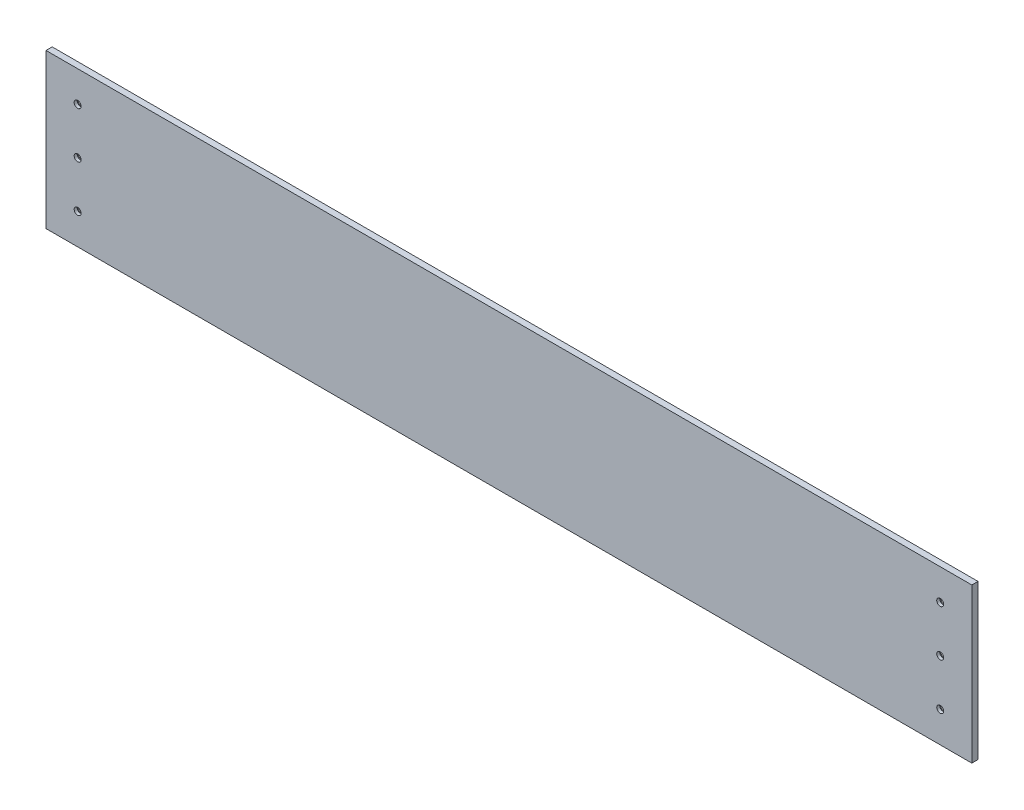
ISO-10303-21;
HEADER;
FILE_DESCRIPTION(('STEP AP214'),'2;1');
FILE_NAME('part.step','',(''),(''),'','','');
FILE_SCHEMA(('AUTOMOTIVE_DESIGN { 1 0 10303 214 1 1 1 1 }'));
ENDSEC;
DATA;
#1=APPLICATION_CONTEXT('core data for automotive mechanical design processes');
#2=APPLICATION_PROTOCOL_DEFINITION('international standard','automotive_design',2000,#1);
#3=PRODUCT_CONTEXT('',#1,'mechanical');
#4=PRODUCT('Part','Part','',(#3));
#5=PRODUCT_RELATED_PRODUCT_CATEGORY('part','',(#4));
#6=PRODUCT_DEFINITION_FORMATION('','',#4);
#7=PRODUCT_DEFINITION_CONTEXT('part definition',#1,'design');
#8=PRODUCT_DEFINITION('design','',#6,#7);
#9=PRODUCT_DEFINITION_SHAPE('','',#8);
#10=(LENGTH_UNIT() NAMED_UNIT(*) SI_UNIT(.MILLI.,.METRE.));
#11=(NAMED_UNIT(*) PLANE_ANGLE_UNIT() SI_UNIT($,.RADIAN.));
#12=(NAMED_UNIT(*) SI_UNIT($,.STERADIAN.) SOLID_ANGLE_UNIT());
#13=UNCERTAINTY_MEASURE_WITH_UNIT(LENGTH_MEASURE(1.E-05),#10,'distance_accuracy_value','');
#14=(GEOMETRIC_REPRESENTATION_CONTEXT(3) GLOBAL_UNCERTAINTY_ASSIGNED_CONTEXT((#13)) GLOBAL_UNIT_ASSIGNED_CONTEXT((#10,
#11,#12)) REPRESENTATION_CONTEXT('',''));
#15=CARTESIAN_POINT('',(0.,0.,0.));
#16=DIRECTION('',(0.,0.,1.));
#17=DIRECTION('',(1.,0.,0.));
#18=AXIS2_PLACEMENT_3D('',#15,#16,#17);
#19=CARTESIAN_POINT('',(579.5,80.,5.6843418860808E-11));
#20=DIRECTION('',(0.,0.,-1.));
#21=DIRECTION('',(-1.,0.,0.));
#22=AXIS2_PLACEMENT_3D('',#19,#20,#21);
#23=CONICAL_SURFACE('',#22,4.29999999994779,0.785398163411313);
#24=CARTESIAN_POINT('',(579.5,80.,2.05));
#25=DIRECTION('',(0.,0.,-1.));
#26=DIRECTION('',(-1.,0.,0.));
#27=AXIS2_PLACEMENT_3D('',#24,#25,#26);
#28=CIRCLE('',#27,2.24999999999997);
#29=CARTESIAN_POINT('',(577.25,80.,2.05));
#30=VERTEX_POINT('',#29);
#31=EDGE_CURVE('E96',#30,#30,#28,.F.);
#32=ORIENTED_EDGE('',*,*,#31,.T.);
#33=EDGE_LOOP('',(#32));
#34=FACE_BOUND('',#33,.T.);
#35=CARTESIAN_POINT('',(579.5,80.,6.08402217493478E-11));
#36=DIRECTION('',(0.,0.,-1.));
#37=DIRECTION('',(-1.,0.,0.));
#38=AXIS2_PLACEMENT_3D('',#35,#36,#37);
#39=CIRCLE('',#38,4.29999999994379);
#40=CARTESIAN_POINT('',(575.200000000056,80.,6.08402217493478E-11));
#41=VERTEX_POINT('',#40);
#42=EDGE_CURVE('E20',#41,#41,#39,.F.);
#43=ORIENTED_EDGE('',*,*,#42,.F.);
#44=EDGE_LOOP('',(#43));
#45=FACE_BOUND('',#44,.T.);
#46=ADVANCED_FACE('F17',(#34,#45),#23,.F.);
#47=CARTESIAN_POINT('',(579.5,50.,5.6843418860808E-11));
#48=DIRECTION('',(0.,0.,-1.));
#49=DIRECTION('',(-1.,0.,0.));
#50=AXIS2_PLACEMENT_3D('',#47,#48,#49);
#51=CONICAL_SURFACE('',#50,4.2999999999479,0.785398163411313);
#52=CARTESIAN_POINT('',(579.5,50.,2.05));
#53=DIRECTION('',(0.,0.,-1.));
#54=DIRECTION('',(-1.,0.,0.));
#55=AXIS2_PLACEMENT_3D('',#52,#53,#54);
#56=CIRCLE('',#55,2.24999999999997);
#57=CARTESIAN_POINT('',(577.25,50.,2.05));
#58=VERTEX_POINT('',#57);
#59=EDGE_CURVE('E93',#58,#58,#56,.F.);
#60=ORIENTED_EDGE('',*,*,#59,.T.);
#61=EDGE_LOOP('',(#60));
#62=FACE_BOUND('',#61,.T.);
#63=CARTESIAN_POINT('',(579.5,50.,6.09512440518072E-11));
#64=DIRECTION('',(0.,0.,-1.));
#65=DIRECTION('',(-1.,0.,0.));
#66=AXIS2_PLACEMENT_3D('',#63,#64,#65);
#67=CIRCLE('',#66,4.29999999994379);
#68=CARTESIAN_POINT('',(575.200000000056,50.,6.09512440518072E-11));
#69=VERTEX_POINT('',#68);
#70=EDGE_CURVE('E128',#69,#69,#67,.F.);
#71=ORIENTED_EDGE('',*,*,#70,.F.);
#72=EDGE_LOOP('',(#71));
#73=FACE_BOUND('',#72,.T.);
#74=ADVANCED_FACE('F137',(#62,#73),#51,.F.);
#75=CARTESIAN_POINT('',(579.5,20.,5.6843418860808E-11));
#76=DIRECTION('',(0.,0.,-1.));
#77=DIRECTION('',(-1.,0.,0.));
#78=AXIS2_PLACEMENT_3D('',#75,#76,#77);
#79=CONICAL_SURFACE('',#78,4.29999999994779,0.785398163411313);
#80=CARTESIAN_POINT('',(579.5,20.,2.05));
#81=DIRECTION('',(0.,0.,-1.));
#82=DIRECTION('',(-1.,0.,0.));
#83=AXIS2_PLACEMENT_3D('',#80,#81,#82);
#84=CIRCLE('',#83,2.24999999999997);
#85=CARTESIAN_POINT('',(577.25,20.,2.05));
#86=VERTEX_POINT('',#85);
#87=EDGE_CURVE('E90',#86,#86,#84,.F.);
#88=ORIENTED_EDGE('',*,*,#87,.T.);
#89=EDGE_LOOP('',(#88));
#90=FACE_BOUND('',#89,.T.);
#91=CARTESIAN_POINT('',(579.5,20.,6.08402217493478E-11));
#92=DIRECTION('',(0.,0.,-1.));
#93=DIRECTION('',(-1.,0.,0.));
#94=AXIS2_PLACEMENT_3D('',#91,#92,#93);
#95=CIRCLE('',#94,4.29999999994379);
#96=CARTESIAN_POINT('',(575.200000000056,20.,6.08402217493478E-11));
#97=VERTEX_POINT('',#96);
#98=EDGE_CURVE('E126',#97,#97,#95,.F.);
#99=ORIENTED_EDGE('',*,*,#98,.F.);
#100=EDGE_LOOP('',(#99));
#101=FACE_BOUND('',#100,.T.);
#102=ADVANCED_FACE('F143',(#90,#101),#79,.F.);
#103=CARTESIAN_POINT('',(20.5,20.,5.6843418860808E-11));
#104=DIRECTION('',(0.,0.,-1.));
#105=DIRECTION('',(-1.,0.,0.));
#106=AXIS2_PLACEMENT_3D('',#103,#104,#105);
#107=CONICAL_SURFACE('',#106,4.29999999991701,0.785398163397448);
#108=CARTESIAN_POINT('',(20.5,20.,2.05));
#109=DIRECTION('',(0.,0.,-1.));
#110=DIRECTION('',(-1.,0.,0.));
#111=AXIS2_PLACEMENT_3D('',#108,#109,#110);
#112=CIRCLE('',#111,2.25);
#113=CARTESIAN_POINT('',(18.25,20.,2.05));
#114=VERTEX_POINT('',#113);
#115=EDGE_CURVE('E87',#114,#114,#112,.F.);
#116=ORIENTED_EDGE('',*,*,#115,.T.);
#117=EDGE_LOOP('',(#116));
#118=FACE_BOUND('',#117,.T.);
#119=CARTESIAN_POINT('',(20.5,20.,0.));
#120=DIRECTION('',(0.,0.,-1.));
#121=DIRECTION('',(-1.,0.,0.));
#122=AXIS2_PLACEMENT_3D('',#119,#120,#121);
#123=CIRCLE('',#122,4.29999999997385);
#124=CARTESIAN_POINT('',(16.2000000000262,20.,0.));
#125=VERTEX_POINT('',#124);
#126=EDGE_CURVE('E123',#125,#125,#123,.F.);
#127=ORIENTED_EDGE('',*,*,#126,.F.);
#128=EDGE_LOOP('',(#127));
#129=FACE_BOUND('',#128,.T.);
#130=ADVANCED_FACE('F198',(#118,#129),#107,.F.);
#131=CARTESIAN_POINT('',(20.5,50.,5.6843418860808E-11));
#132=DIRECTION('',(0.,0.,-1.));
#133=DIRECTION('',(-1.,0.,0.));
#134=AXIS2_PLACEMENT_3D('',#131,#132,#133);
#135=CONICAL_SURFACE('',#134,4.29999999991698,0.785398163397448);
#136=CARTESIAN_POINT('',(20.5,50.,2.05));
#137=DIRECTION('',(0.,0.,-1.));
#138=DIRECTION('',(-1.,0.,0.));
#139=AXIS2_PLACEMENT_3D('',#136,#137,#138);
#140=CIRCLE('',#139,2.25);
#141=CARTESIAN_POINT('',(18.25,50.,2.05));
#142=VERTEX_POINT('',#141);
#143=EDGE_CURVE('E84',#142,#142,#140,.F.);
#144=ORIENTED_EDGE('',*,*,#143,.T.);
#145=EDGE_LOOP('',(#144));
#146=FACE_BOUND('',#145,.T.);
#147=CARTESIAN_POINT('',(20.5,50.,0.));
#148=DIRECTION('',(0.,0.,-1.));
#149=DIRECTION('',(-1.,0.,0.));
#150=AXIS2_PLACEMENT_3D('',#147,#148,#149);
#151=CIRCLE('',#150,4.29999999997382);
#152=CARTESIAN_POINT('',(16.2000000000262,50.,0.));
#153=VERTEX_POINT('',#152);
#154=EDGE_CURVE('E120',#153,#153,#151,.F.);
#155=ORIENTED_EDGE('',*,*,#154,.F.);
#156=EDGE_LOOP('',(#155));
#157=FACE_BOUND('',#156,.T.);
#158=ADVANCED_FACE('F194',(#146,#157),#135,.F.);
#159=CARTESIAN_POINT('',(20.5,80.,5.6843418860808E-11));
#160=DIRECTION('',(0.,0.,-1.));
#161=DIRECTION('',(-1.,0.,0.));
#162=AXIS2_PLACEMENT_3D('',#159,#160,#161);
#163=CONICAL_SURFACE('',#162,4.29999999991701,0.785398163397448);
#164=CARTESIAN_POINT('',(20.5,80.,2.05));
#165=DIRECTION('',(0.,0.,-1.));
#166=DIRECTION('',(-1.,0.,0.));
#167=AXIS2_PLACEMENT_3D('',#164,#165,#166);
#168=CIRCLE('',#167,2.25);
#169=CARTESIAN_POINT('',(18.25,80.,2.05));
#170=VERTEX_POINT('',#169);
#171=EDGE_CURVE('E67',#170,#170,#168,.F.);
#172=ORIENTED_EDGE('',*,*,#171,.T.);
#173=EDGE_LOOP('',(#172));
#174=FACE_BOUND('',#173,.T.);
#175=CARTESIAN_POINT('',(20.5,80.,0.));
#176=DIRECTION('',(0.,0.,-1.));
#177=DIRECTION('',(-1.,0.,0.));
#178=AXIS2_PLACEMENT_3D('',#175,#176,#177);
#179=CIRCLE('',#178,4.29999999997385);
#180=CARTESIAN_POINT('',(16.2000000000262,80.,0.));
#181=VERTEX_POINT('',#180);
#182=EDGE_CURVE('E99',#181,#181,#179,.F.);
#183=ORIENTED_EDGE('',*,*,#182,.F.);
#184=EDGE_LOOP('',(#183));
#185=FACE_BOUND('',#184,.T.);
#186=ADVANCED_FACE('F191',(#174,#185),#163,.F.);
#187=CARTESIAN_POINT('',(0.,0.,0.));
#188=DIRECTION('',(0.,0.,-1.));
#189=DIRECTION('',(-1.,0.,0.));
#190=AXIS2_PLACEMENT_3D('',#187,#188,#189);
#191=PLANE('',#190);
#192=DIRECTION('',(0.,1.,0.));
#193=VECTOR('',#192,1.);
#194=CARTESIAN_POINT('',(600.,0.,0.));
#195=LINE('',#194,#193);
#196=CARTESIAN_POINT('',(600.,100.,0.));
#197=VERTEX_POINT('',#196);
#198=CARTESIAN_POINT('',(600.,0.,0.));
#199=VERTEX_POINT('',#198);
#200=EDGE_CURVE('E55',#197,#199,#195,.F.);
#201=ORIENTED_EDGE('',*,*,#200,.T.);
#202=DIRECTION('',(1.,0.,0.));
#203=VECTOR('',#202,1.);
#204=CARTESIAN_POINT('',(0.,0.,0.));
#205=LINE('',#204,#203);
#206=CARTESIAN_POINT('',(0.,0.,0.));
#207=VERTEX_POINT('',#206);
#208=EDGE_CURVE('E352',#199,#207,#205,.F.);
#209=ORIENTED_EDGE('',*,*,#208,.T.);
#210=DIRECTION('',(0.,1.,0.));
#211=VECTOR('',#210,1.);
#212=CARTESIAN_POINT('',(0.,0.,0.));
#213=LINE('',#212,#211);
#214=CARTESIAN_POINT('',(0.,100.,0.));
#215=VERTEX_POINT('',#214);
#216=EDGE_CURVE('E61',#207,#215,#213,.T.);
#217=ORIENTED_EDGE('',*,*,#216,.T.);
#218=DIRECTION('',(1.,0.,0.));
#219=VECTOR('',#218,1.);
#220=CARTESIAN_POINT('',(0.,100.,0.));
#221=LINE('',#220,#219);
#222=EDGE_CURVE('E58',#215,#197,#221,.T.);
#223=ORIENTED_EDGE('',*,*,#222,.T.);
#224=EDGE_LOOP('',(#201,#209,#217,#223));
#225=FACE_BOUND('',#224,.T.);
#226=ORIENTED_EDGE('',*,*,#182,.T.);
#227=EDGE_LOOP('',(#226));
#228=FACE_BOUND('',#227,.T.);
#229=ORIENTED_EDGE('',*,*,#154,.T.);
#230=EDGE_LOOP('',(#229));
#231=FACE_BOUND('',#230,.T.);
#232=ORIENTED_EDGE('',*,*,#126,.T.);
#233=EDGE_LOOP('',(#232));
#234=FACE_BOUND('',#233,.T.);
#235=ORIENTED_EDGE('',*,*,#98,.T.);
#236=EDGE_LOOP('',(#235));
#237=FACE_BOUND('',#236,.T.);
#238=ORIENTED_EDGE('',*,*,#70,.T.);
#239=EDGE_LOOP('',(#238));
#240=FACE_BOUND('',#239,.T.);
#241=ORIENTED_EDGE('',*,*,#42,.T.);
#242=EDGE_LOOP('',(#241));
#243=FACE_BOUND('',#242,.T.);
#244=ADVANCED_FACE('F59',(#225,#228,#231,#234,#237,#240,#243),#191,.T.);
#245=CARTESIAN_POINT('',(579.5,80.,0.));
#246=DIRECTION('',(0.,0.,-1.));
#247=DIRECTION('',(-1.,0.,0.));
#248=AXIS2_PLACEMENT_3D('',#245,#246,#247);
#249=CYLINDRICAL_SURFACE('',#248,2.24999999999997);
#250=CARTESIAN_POINT('',(579.5,80.,4.));
#251=DIRECTION('',(0.,0.,-1.));
#252=DIRECTION('',(-1.,0.,0.));
#253=AXIS2_PLACEMENT_3D('',#250,#251,#252);
#254=CIRCLE('',#253,2.24999999999997);
#255=CARTESIAN_POINT('',(577.25,80.,4.));
#256=VERTEX_POINT('',#255);
#257=EDGE_CURVE('E115',#256,#256,#254,.F.);
#258=ORIENTED_EDGE('',*,*,#257,.T.);
#259=EDGE_LOOP('',(#258));
#260=FACE_BOUND('',#259,.T.);
#261=ORIENTED_EDGE('',*,*,#31,.F.);
#262=EDGE_LOOP('',(#261));
#263=FACE_BOUND('',#262,.T.);
#264=ADVANCED_FACE('F184',(#260,#263),#249,.F.);
#265=CARTESIAN_POINT('',(579.5,50.,0.));
#266=DIRECTION('',(0.,0.,-1.));
#267=DIRECTION('',(-1.,0.,0.));
#268=AXIS2_PLACEMENT_3D('',#265,#266,#267);
#269=CYLINDRICAL_SURFACE('',#268,2.24999999999997);
#270=CARTESIAN_POINT('',(579.5,50.,4.));
#271=DIRECTION('',(0.,0.,-1.));
#272=DIRECTION('',(-1.,0.,0.));
#273=AXIS2_PLACEMENT_3D('',#270,#271,#272);
#274=CIRCLE('',#273,2.24999999999997);
#275=CARTESIAN_POINT('',(577.25,50.,4.));
#276=VERTEX_POINT('',#275);
#277=EDGE_CURVE('E112',#276,#276,#274,.F.);
#278=ORIENTED_EDGE('',*,*,#277,.T.);
#279=EDGE_LOOP('',(#278));
#280=FACE_BOUND('',#279,.T.);
#281=ORIENTED_EDGE('',*,*,#59,.F.);
#282=EDGE_LOOP('',(#281));
#283=FACE_BOUND('',#282,.T.);
#284=ADVANCED_FACE('F180',(#280,#283),#269,.F.);
#285=CARTESIAN_POINT('',(579.5,20.,0.));
#286=DIRECTION('',(0.,0.,-1.));
#287=DIRECTION('',(-1.,0.,0.));
#288=AXIS2_PLACEMENT_3D('',#285,#286,#287);
#289=CYLINDRICAL_SURFACE('',#288,2.24999999999997);
#290=CARTESIAN_POINT('',(579.5,20.,4.));
#291=DIRECTION('',(0.,0.,-1.));
#292=DIRECTION('',(-1.,0.,0.));
#293=AXIS2_PLACEMENT_3D('',#290,#291,#292);
#294=CIRCLE('',#293,2.24999999999997);
#295=CARTESIAN_POINT('',(577.25,20.,4.));
#296=VERTEX_POINT('',#295);
#297=EDGE_CURVE('E109',#296,#296,#294,.F.);
#298=ORIENTED_EDGE('',*,*,#297,.T.);
#299=EDGE_LOOP('',(#298));
#300=FACE_BOUND('',#299,.T.);
#301=ORIENTED_EDGE('',*,*,#87,.F.);
#302=EDGE_LOOP('',(#301));
#303=FACE_BOUND('',#302,.T.);
#304=ADVANCED_FACE('F176',(#300,#303),#289,.F.);
#305=CARTESIAN_POINT('',(20.5,20.,0.));
#306=DIRECTION('',(0.,0.,-1.));
#307=DIRECTION('',(-1.,0.,0.));
#308=AXIS2_PLACEMENT_3D('',#305,#306,#307);
#309=CYLINDRICAL_SURFACE('',#308,2.25);
#310=CARTESIAN_POINT('',(20.5,20.,4.));
#311=DIRECTION('',(0.,0.,-1.));
#312=DIRECTION('',(-1.,0.,0.));
#313=AXIS2_PLACEMENT_3D('',#310,#311,#312);
#314=CIRCLE('',#313,2.25);
#315=CARTESIAN_POINT('',(18.25,20.,4.));
#316=VERTEX_POINT('',#315);
#317=EDGE_CURVE('E106',#316,#316,#314,.F.);
#318=ORIENTED_EDGE('',*,*,#317,.T.);
#319=EDGE_LOOP('',(#318));
#320=FACE_BOUND('',#319,.T.);
#321=ORIENTED_EDGE('',*,*,#115,.F.);
#322=EDGE_LOOP('',(#321));
#323=FACE_BOUND('',#322,.T.);
#324=ADVANCED_FACE('F172',(#320,#323),#309,.F.);
#325=CARTESIAN_POINT('',(20.5,50.,0.));
#326=DIRECTION('',(0.,0.,-1.));
#327=DIRECTION('',(-1.,0.,0.));
#328=AXIS2_PLACEMENT_3D('',#325,#326,#327);
#329=CYLINDRICAL_SURFACE('',#328,2.25);
#330=CARTESIAN_POINT('',(20.5,50.,4.));
#331=DIRECTION('',(0.,0.,-1.));
#332=DIRECTION('',(-1.,0.,0.));
#333=AXIS2_PLACEMENT_3D('',#330,#331,#332);
#334=CIRCLE('',#333,2.25);
#335=CARTESIAN_POINT('',(18.25,50.,4.));
#336=VERTEX_POINT('',#335);
#337=EDGE_CURVE('E103',#336,#336,#334,.F.);
#338=ORIENTED_EDGE('',*,*,#337,.T.);
#339=EDGE_LOOP('',(#338));
#340=FACE_BOUND('',#339,.T.);
#341=ORIENTED_EDGE('',*,*,#143,.F.);
#342=EDGE_LOOP('',(#341));
#343=FACE_BOUND('',#342,.T.);
#344=ADVANCED_FACE('F168',(#340,#343),#329,.F.);
#345=CARTESIAN_POINT('',(20.5,80.,0.));
#346=DIRECTION('',(0.,0.,-1.));
#347=DIRECTION('',(-1.,0.,0.));
#348=AXIS2_PLACEMENT_3D('',#345,#346,#347);
#349=CYLINDRICAL_SURFACE('',#348,2.25);
#350=CARTESIAN_POINT('',(20.5,80.,4.));
#351=DIRECTION('',(0.,0.,-1.));
#352=DIRECTION('',(-1.,0.,0.));
#353=AXIS2_PLACEMENT_3D('',#350,#351,#352);
#354=CIRCLE('',#353,2.25);
#355=CARTESIAN_POINT('',(18.25,80.,4.));
#356=VERTEX_POINT('',#355);
#357=EDGE_CURVE('E100',#356,#356,#354,.F.);
#358=ORIENTED_EDGE('',*,*,#357,.T.);
#359=EDGE_LOOP('',(#358));
#360=FACE_BOUND('',#359,.T.);
#361=ORIENTED_EDGE('',*,*,#171,.F.);
#362=EDGE_LOOP('',(#361));
#363=FACE_BOUND('',#362,.T.);
#364=ADVANCED_FACE('F165',(#360,#363),#349,.F.);
#365=CARTESIAN_POINT('',(0.,100.,4.));
#366=DIRECTION('',(0.,-1.,0.));
#367=DIRECTION('',(0.,0.,-1.));
#368=AXIS2_PLACEMENT_3D('',#365,#366,#367);
#369=PLANE('',#368);
#370=DIRECTION('',(0.,0.,-1.));
#371=VECTOR('',#370,1.);
#372=CARTESIAN_POINT('',(0.,100.,4.));
#373=LINE('',#372,#371);
#374=CARTESIAN_POINT('',(0.,100.,4.));
#375=VERTEX_POINT('',#374);
#376=EDGE_CURVE('E360',#215,#375,#373,.F.);
#377=ORIENTED_EDGE('',*,*,#376,.T.);
#378=DIRECTION('',(-1.,0.,0.));
#379=VECTOR('',#378,1.);
#380=CARTESIAN_POINT('',(0.,100.,4.));
#381=LINE('',#380,#379);
#382=CARTESIAN_POINT('',(600.,100.,4.));
#383=VERTEX_POINT('',#382);
#384=EDGE_CURVE('E78',#375,#383,#381,.F.);
#385=ORIENTED_EDGE('',*,*,#384,.T.);
#386=DIRECTION('',(0.,0.,1.));
#387=VECTOR('',#386,1.);
#388=CARTESIAN_POINT('',(600.,100.,4.));
#389=LINE('',#388,#387);
#390=EDGE_CURVE('E66',#383,#197,#389,.F.);
#391=ORIENTED_EDGE('',*,*,#390,.T.);
#392=ORIENTED_EDGE('',*,*,#222,.F.);
#393=EDGE_LOOP('',(#377,#385,#391,#392));
#394=FACE_BOUND('',#393,.T.);
#395=ADVANCED_FACE('F77',(#394),#369,.F.);
#396=CARTESIAN_POINT('',(600.,0.,4.));
#397=DIRECTION('',(-1.,0.,0.));
#398=DIRECTION('',(0.,0.,1.));
#399=AXIS2_PLACEMENT_3D('',#396,#397,#398);
#400=PLANE('',#399);
#401=ORIENTED_EDGE('',*,*,#390,.F.);
#402=DIRECTION('',(0.,1.,0.));
#403=VECTOR('',#402,1.);
#404=CARTESIAN_POINT('',(600.,0.,4.));
#405=LINE('',#404,#403);
#406=CARTESIAN_POINT('',(600.,0.,4.));
#407=VERTEX_POINT('',#406);
#408=EDGE_CURVE('E353',#383,#407,#405,.F.);
#409=ORIENTED_EDGE('',*,*,#408,.T.);
#410=DIRECTION('',(0.,0.,1.));
#411=VECTOR('',#410,1.);
#412=CARTESIAN_POINT('',(600.,0.,4.));
#413=LINE('',#412,#411);
#414=EDGE_CURVE('E74',#407,#199,#413,.F.);
#415=ORIENTED_EDGE('',*,*,#414,.T.);
#416=ORIENTED_EDGE('',*,*,#200,.F.);
#417=EDGE_LOOP('',(#401,#409,#415,#416));
#418=FACE_BOUND('',#417,.T.);
#419=ADVANCED_FACE('F71',(#418),#400,.F.);
#420=CARTESIAN_POINT('',(0.,0.,4.));
#421=DIRECTION('',(0.,1.,0.));
#422=DIRECTION('',(0.,0.,1.));
#423=AXIS2_PLACEMENT_3D('',#420,#421,#422);
#424=PLANE('',#423);
#425=ORIENTED_EDGE('',*,*,#414,.F.);
#426=DIRECTION('',(-1.,0.,0.));
#427=VECTOR('',#426,1.);
#428=CARTESIAN_POINT('',(0.,0.,4.));
#429=LINE('',#428,#427);
#430=CARTESIAN_POINT('',(0.,0.,4.));
#431=VERTEX_POINT('',#430);
#432=EDGE_CURVE('E26',#407,#431,#429,.T.);
#433=ORIENTED_EDGE('',*,*,#432,.T.);
#434=DIRECTION('',(0.,0.,-1.));
#435=VECTOR('',#434,1.);
#436=CARTESIAN_POINT('',(0.,0.,4.));
#437=LINE('',#436,#435);
#438=EDGE_CURVE('E34',#431,#207,#437,.T.);
#439=ORIENTED_EDGE('',*,*,#438,.T.);
#440=ORIENTED_EDGE('',*,*,#208,.F.);
#441=EDGE_LOOP('',(#425,#433,#439,#440));
#442=FACE_BOUND('',#441,.T.);
#443=ADVANCED_FACE('F153',(#442),#424,.F.);
#444=CARTESIAN_POINT('',(0.,0.,4.));
#445=DIRECTION('',(1.,0.,0.));
#446=DIRECTION('',(0.,0.,-1.));
#447=AXIS2_PLACEMENT_3D('',#444,#445,#446);
#448=PLANE('',#447);
#449=ORIENTED_EDGE('',*,*,#438,.F.);
#450=DIRECTION('',(0.,1.,0.));
#451=VECTOR('',#450,1.);
#452=CARTESIAN_POINT('',(0.,0.,4.));
#453=LINE('',#452,#451);
#454=EDGE_CURVE('E11',#431,#375,#453,.T.);
#455=ORIENTED_EDGE('',*,*,#454,.T.);
#456=ORIENTED_EDGE('',*,*,#376,.F.);
#457=ORIENTED_EDGE('',*,*,#216,.F.);
#458=EDGE_LOOP('',(#449,#455,#456,#457));
#459=FACE_BOUND('',#458,.T.);
#460=ADVANCED_FACE('F147',(#459),#448,.F.);
#461=CARTESIAN_POINT('',(0.,0.,4.));
#462=DIRECTION('',(0.,0.,-1.));
#463=DIRECTION('',(-1.,0.,0.));
#464=AXIS2_PLACEMENT_3D('',#461,#462,#463);
#465=PLANE('',#464);
#466=ORIENTED_EDGE('',*,*,#432,.F.);
#467=ORIENTED_EDGE('',*,*,#408,.F.);
#468=ORIENTED_EDGE('',*,*,#384,.F.);
#469=ORIENTED_EDGE('',*,*,#454,.F.);
#470=EDGE_LOOP('',(#466,#467,#468,#469));
#471=FACE_BOUND('',#470,.T.);
#472=ORIENTED_EDGE('',*,*,#357,.F.);
#473=EDGE_LOOP('',(#472));
#474=FACE_BOUND('',#473,.T.);
#475=ORIENTED_EDGE('',*,*,#337,.F.);
#476=EDGE_LOOP('',(#475));
#477=FACE_BOUND('',#476,.T.);
#478=ORIENTED_EDGE('',*,*,#317,.F.);
#479=EDGE_LOOP('',(#478));
#480=FACE_BOUND('',#479,.T.);
#481=ORIENTED_EDGE('',*,*,#297,.F.);
#482=EDGE_LOOP('',(#481));
#483=FACE_BOUND('',#482,.T.);
#484=ORIENTED_EDGE('',*,*,#277,.F.);
#485=EDGE_LOOP('',(#484));
#486=FACE_BOUND('',#485,.T.);
#487=ORIENTED_EDGE('',*,*,#257,.F.);
#488=EDGE_LOOP('',(#487));
#489=FACE_BOUND('',#488,.T.);
#490=ADVANCED_FACE('F145',(#471,#474,#477,#480,#483,#486,#489),#465,.F.);
#491=CLOSED_SHELL('',(#46,#74,#102,#130,#158,#186,#244,#264,#284,#304,#324,#344,#364,#395,#419,
#443,#460,#490));
#492=MANIFOLD_SOLID_BREP('B1',#491);
#493=ADVANCED_BREP_SHAPE_REPRESENTATION('',(#18,#492),#14);
#494=SHAPE_DEFINITION_REPRESENTATION(#9,#493);
ENDSEC;
END-ISO-10303-21;
